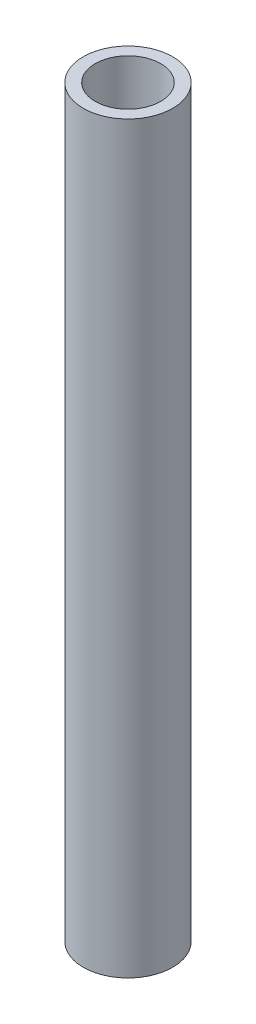
ISO-10303-21;
HEADER;
FILE_DESCRIPTION(('STEP AP214'),'2;1');
FILE_NAME('part.step','',(''),(''),'','','');
FILE_SCHEMA(('AUTOMOTIVE_DESIGN { 1 0 10303 214 1 1 1 1 }'));
ENDSEC;
DATA;
#1=APPLICATION_CONTEXT('core data for automotive mechanical design processes');
#2=APPLICATION_PROTOCOL_DEFINITION('international standard','automotive_design',2000,#1);
#3=PRODUCT_CONTEXT('',#1,'mechanical');
#4=PRODUCT('Part','Part','',(#3));
#5=PRODUCT_RELATED_PRODUCT_CATEGORY('part','',(#4));
#6=PRODUCT_DEFINITION_FORMATION('','',#4);
#7=PRODUCT_DEFINITION_CONTEXT('part definition',#1,'design');
#8=PRODUCT_DEFINITION('design','',#6,#7);
#9=PRODUCT_DEFINITION_SHAPE('','',#8);
#10=(LENGTH_UNIT() NAMED_UNIT(*) SI_UNIT(.MILLI.,.METRE.));
#11=(NAMED_UNIT(*) PLANE_ANGLE_UNIT() SI_UNIT($,.RADIAN.));
#12=(NAMED_UNIT(*) SI_UNIT($,.STERADIAN.) SOLID_ANGLE_UNIT());
#13=UNCERTAINTY_MEASURE_WITH_UNIT(LENGTH_MEASURE(1.E-05),#10,'distance_accuracy_value','');
#14=(GEOMETRIC_REPRESENTATION_CONTEXT(3) GLOBAL_UNCERTAINTY_ASSIGNED_CONTEXT((#13)) GLOBAL_UNIT_ASSIGNED_CONTEXT((#10,
#11,#12)) REPRESENTATION_CONTEXT('',''));
#15=CARTESIAN_POINT('',(0.,0.,0.));
#16=DIRECTION('',(0.,0.,1.));
#17=DIRECTION('',(1.,0.,0.));
#18=AXIS2_PLACEMENT_3D('',#15,#16,#17);
#19=CARTESIAN_POINT('',(0.,7.5,0.));
#20=DIRECTION('',(0.,-1.,0.));
#21=DIRECTION('',(0.,0.,-1.));
#22=AXIS2_PLACEMENT_3D('',#19,#20,#21);
#23=CYLINDRICAL_SURFACE('',#22,0.3302);
#24=CARTESIAN_POINT('',(0.,7.5,0.));
#25=DIRECTION('',(0.,1.,0.));
#26=DIRECTION('',(0.,0.,1.));
#27=AXIS2_PLACEMENT_3D('',#24,#25,#26);
#28=CIRCLE('',#27,0.3302);
#29=CARTESIAN_POINT('',(0.,7.5,0.3302));
#30=VERTEX_POINT('',#29);
#31=EDGE_CURVE('E40',#30,#30,#28,.T.);
#32=ORIENTED_EDGE('',*,*,#31,.T.);
#33=EDGE_LOOP('',(#32));
#34=FACE_BOUND('',#33,.T.);
#35=CARTESIAN_POINT('',(0.,0.,0.));
#36=DIRECTION('',(0.,1.,0.));
#37=DIRECTION('',(0.,0.,1.));
#38=AXIS2_PLACEMENT_3D('',#35,#36,#37);
#39=CIRCLE('',#38,0.3302);
#40=CARTESIAN_POINT('',(0.,0.,0.3302));
#41=VERTEX_POINT('',#40);
#42=EDGE_CURVE('E46',#41,#41,#39,.T.);
#43=ORIENTED_EDGE('',*,*,#42,.F.);
#44=EDGE_LOOP('',(#43));
#45=FACE_BOUND('',#44,.T.);
#46=ADVANCED_FACE('F33',(#34,#45),#23,.F.);
#47=CARTESIAN_POINT('',(0.,7.5,0.));
#48=DIRECTION('',(0.,-1.,0.));
#49=DIRECTION('',(0.,0.,-1.));
#50=AXIS2_PLACEMENT_3D('',#47,#48,#49);
#51=CYLINDRICAL_SURFACE('',#50,0.45085);
#52=CARTESIAN_POINT('',(0.,7.5,0.));
#53=DIRECTION('',(0.,1.,0.));
#54=DIRECTION('',(0.,0.,1.));
#55=AXIS2_PLACEMENT_3D('',#52,#53,#54);
#56=CIRCLE('',#55,0.45085);
#57=CARTESIAN_POINT('',(0.,7.5,0.45085));
#58=VERTEX_POINT('',#57);
#59=EDGE_CURVE('E10',#58,#58,#56,.T.);
#60=ORIENTED_EDGE('',*,*,#59,.F.);
#61=EDGE_LOOP('',(#60));
#62=FACE_BOUND('',#61,.T.);
#63=CARTESIAN_POINT('',(0.,0.,0.));
#64=DIRECTION('',(0.,1.,0.));
#65=DIRECTION('',(0.,0.,1.));
#66=AXIS2_PLACEMENT_3D('',#63,#64,#65);
#67=CIRCLE('',#66,0.45085);
#68=CARTESIAN_POINT('',(0.,0.,0.45085));
#69=VERTEX_POINT('',#68);
#70=EDGE_CURVE('E36',#69,#69,#67,.T.);
#71=ORIENTED_EDGE('',*,*,#70,.T.);
#72=EDGE_LOOP('',(#71));
#73=FACE_BOUND('',#72,.T.);
#74=ADVANCED_FACE('F53',(#62,#73),#51,.T.);
#75=CARTESIAN_POINT('',(0.,7.5,0.));
#76=DIRECTION('',(0.,1.,0.));
#77=DIRECTION('',(0.,0.,1.));
#78=AXIS2_PLACEMENT_3D('',#75,#76,#77);
#79=PLANE('',#78);
#80=ORIENTED_EDGE('',*,*,#31,.F.);
#81=EDGE_LOOP('',(#80));
#82=FACE_BOUND('',#81,.T.);
#83=ORIENTED_EDGE('',*,*,#59,.T.);
#84=EDGE_LOOP('',(#83));
#85=FACE_BOUND('',#84,.T.);
#86=ADVANCED_FACE('F57',(#82,#85),#79,.T.);
#87=CARTESIAN_POINT('',(0.,0.,0.));
#88=DIRECTION('',(0.,1.,0.));
#89=DIRECTION('',(0.,0.,1.));
#90=AXIS2_PLACEMENT_3D('',#87,#88,#89);
#91=PLANE('',#90);
#92=ORIENTED_EDGE('',*,*,#42,.T.);
#93=EDGE_LOOP('',(#92));
#94=FACE_BOUND('',#93,.T.);
#95=ORIENTED_EDGE('',*,*,#70,.F.);
#96=EDGE_LOOP('',(#95));
#97=FACE_BOUND('',#96,.T.);
#98=ADVANCED_FACE('F55',(#94,#97),#91,.F.);
#99=CLOSED_SHELL('',(#46,#74,#86,#98));
#100=MANIFOLD_SOLID_BREP('B2',#99);
#101=ADVANCED_BREP_SHAPE_REPRESENTATION('',(#18,#100),#14);
#102=SHAPE_DEFINITION_REPRESENTATION(#9,#101);
ENDSEC;
END-ISO-10303-21;
